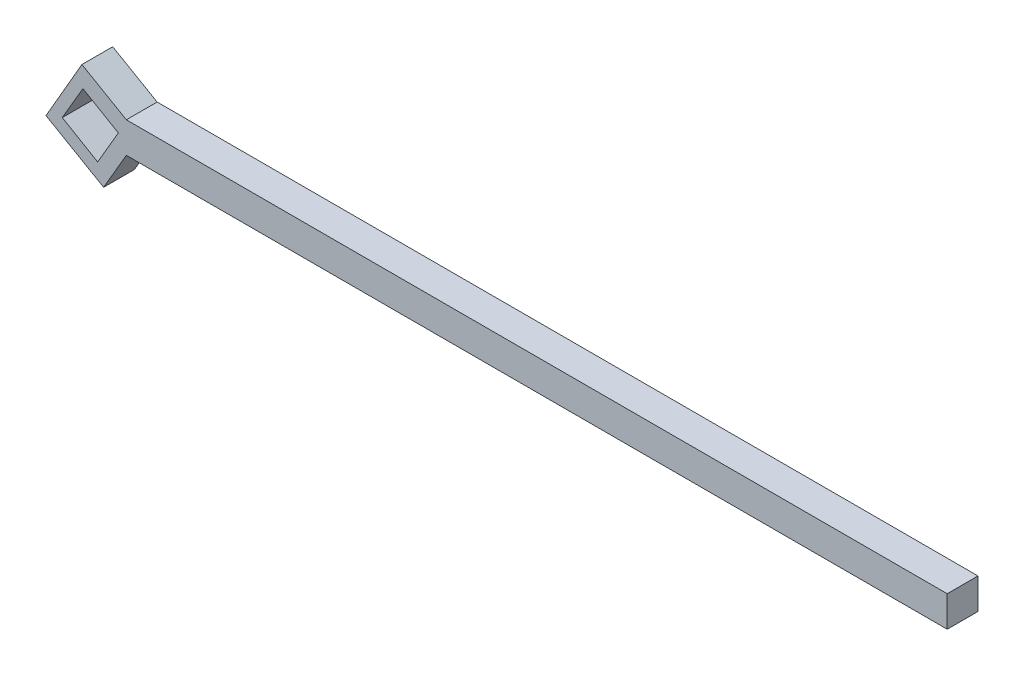
ISO-10303-21;
HEADER;
FILE_DESCRIPTION(('STEP AP214'),'2;1');
FILE_NAME('part.step','',(''),(''),'','','');
FILE_SCHEMA(('AUTOMOTIVE_DESIGN { 1 0 10303 214 1 1 1 1 }'));
ENDSEC;
DATA;
#1=APPLICATION_CONTEXT('core data for automotive mechanical design processes');
#2=APPLICATION_PROTOCOL_DEFINITION('international standard','automotive_design',2000,#1);
#3=PRODUCT_CONTEXT('',#1,'mechanical');
#4=PRODUCT('Part','Part','',(#3));
#5=PRODUCT_RELATED_PRODUCT_CATEGORY('part','',(#4));
#6=PRODUCT_DEFINITION_FORMATION('','',#4);
#7=PRODUCT_DEFINITION_CONTEXT('part definition',#1,'design');
#8=PRODUCT_DEFINITION('design','',#6,#7);
#9=PRODUCT_DEFINITION_SHAPE('','',#8);
#10=(LENGTH_UNIT() NAMED_UNIT(*) SI_UNIT(.MILLI.,.METRE.));
#11=(NAMED_UNIT(*) PLANE_ANGLE_UNIT() SI_UNIT($,.RADIAN.));
#12=(NAMED_UNIT(*) SI_UNIT($,.STERADIAN.) SOLID_ANGLE_UNIT());
#13=UNCERTAINTY_MEASURE_WITH_UNIT(LENGTH_MEASURE(1.E-05),#10,'distance_accuracy_value','');
#14=(GEOMETRIC_REPRESENTATION_CONTEXT(3) GLOBAL_UNCERTAINTY_ASSIGNED_CONTEXT((#13)) GLOBAL_UNIT_ASSIGNED_CONTEXT((#10,
#11,#12)) REPRESENTATION_CONTEXT('',''));
#15=CARTESIAN_POINT('',(0.,0.,0.));
#16=DIRECTION('',(0.,0.,1.));
#17=DIRECTION('',(1.,0.,0.));
#18=AXIS2_PLACEMENT_3D('',#15,#16,#17);
#19=CARTESIAN_POINT('',(0.,0.,15.));
#20=DIRECTION('',(0.,0.,1.));
#21=DIRECTION('',(1.,0.,0.));
#22=AXIS2_PLACEMENT_3D('',#19,#20,#21);
#23=PLANE('',#22);
#24=DIRECTION('',(0.502688216533599,0.864467788271067,0.));
#25=VECTOR('',#24,1.);
#26=CARTESIAN_POINT('',(-370.899758444666,-19.0266984378067,15.));
#27=LINE('',#26,#25);
#28=CARTESIAN_POINT('',(-370.899758444666,-19.0266984378067,15.));
#29=VERTEX_POINT('',#28);
#30=CARTESIAN_POINT('',(-359.835728952772,0.,15.));
#31=VERTEX_POINT('',#30);
#32=EDGE_CURVE('E153',#29,#31,#27,.T.);
#33=ORIENTED_EDGE('',*,*,#32,.T.);
#34=DIRECTION('',(1.,0.,0.));
#35=VECTOR('',#34,1.);
#36=CARTESIAN_POINT('',(40.1642710472279,0.,15.));
#37=LINE('',#36,#35);
#38=CARTESIAN_POINT('',(40.1642710472279,0.,15.));
#39=VERTEX_POINT('',#38);
#40=EDGE_CURVE('E156',#31,#39,#37,.T.);
#41=ORIENTED_EDGE('',*,*,#40,.T.);
#42=DIRECTION('',(0.,1.,0.));
#43=VECTOR('',#42,1.);
#44=CARTESIAN_POINT('',(40.1642710472279,15.,15.));
#45=LINE('',#44,#43);
#46=CARTESIAN_POINT('',(40.1642710472279,15.,15.));
#47=VERTEX_POINT('',#46);
#48=EDGE_CURVE('E159',#39,#47,#45,.T.);
#49=ORIENTED_EDGE('',*,*,#48,.T.);
#50=DIRECTION('',(-1.,0.,0.));
#51=VECTOR('',#50,1.);
#52=CARTESIAN_POINT('',(-359.835728952772,15.,15.));
#53=LINE('',#52,#51);
#54=CARTESIAN_POINT('',(-359.835728952772,15.,15.));
#55=VERTEX_POINT('',#54);
#56=EDGE_CURVE('E161',#47,#55,#53,.T.);
#57=ORIENTED_EDGE('',*,*,#56,.T.);
#58=DIRECTION('',(-0.866025403784438,0.5,0.));
#59=VECTOR('',#58,1.);
#60=CARTESIAN_POINT('',(-359.835728952772,15.,15.));
#61=LINE('',#60,#59);
#62=CARTESIAN_POINT('',(-381.486364047383,27.5,15.));
#63=VERTEX_POINT('',#62);
#64=EDGE_CURVE('E163',#55,#63,#61,.T.);
#65=ORIENTED_EDGE('',*,*,#64,.T.);
#66=DIRECTION('',(-0.499999999999999,-0.866025403784439,0.));
#67=VECTOR('',#66,1.);
#68=CARTESIAN_POINT('',(-381.486364047383,27.5,15.));
#69=LINE('',#68,#67);
#70=CARTESIAN_POINT('',(-398.986364047383,-2.81088913245537,15.));
#71=VERTEX_POINT('',#70);
#72=EDGE_CURVE('E165',#63,#71,#69,.T.);
#73=ORIENTED_EDGE('',*,*,#72,.T.);
#74=DIRECTION('',(0.866025403784438,-0.5,0.));
#75=VECTOR('',#74,1.);
#76=CARTESIAN_POINT('',(-398.986364047383,-2.81088913245537,15.));
#77=LINE('',#76,#75);
#78=EDGE_CURVE('E167',#71,#29,#77,.T.);
#79=ORIENTED_EDGE('',*,*,#78,.T.);
#80=EDGE_LOOP('',(#33,#41,#49,#57,#65,#73,#79));
#81=FACE_BOUND('',#80,.T.);
#82=DIRECTION('',(-0.863665805975953,0.504064852561561,0.));
#83=VECTOR('',#82,1.);
#84=CARTESIAN_POINT('',(-380.991936483583,17.5812970512311,15.));
#85=LINE('',#84,#83);
#86=CARTESIAN_POINT('',(-363.718620364064,7.5,15.));
#87=VERTEX_POINT('',#86);
#88=CARTESIAN_POINT('',(-380.991936483583,17.5812970512311,15.));
#89=VERTEX_POINT('',#88);
#90=EDGE_CURVE('E125',#87,#89,#85,.T.);
#91=ORIENTED_EDGE('',*,*,#90,.F.);
#92=DIRECTION('',(0.504064852561559,0.863665805975954,0.));
#93=VECTOR('',#92,1.);
#94=CARTESIAN_POINT('',(-363.718620364064,7.5,15.));
#95=LINE('',#94,#93);
#96=CARTESIAN_POINT('',(-373.799917415295,-9.77331611951907,15.));
#97=VERTEX_POINT('',#96);
#98=EDGE_CURVE('E117',#97,#87,#95,.T.);
#99=ORIENTED_EDGE('',*,*,#98,.F.);
#100=DIRECTION('',(0.863665805975953,-0.504064852561561,0.));
#101=VECTOR('',#100,1.);
#102=CARTESIAN_POINT('',(-373.799917415295,-9.77331611951907,15.));
#103=LINE('',#102,#101);
#104=CARTESIAN_POINT('',(-391.073233534814,0.307980931712137,15.));
#105=VERTEX_POINT('',#104);
#106=EDGE_CURVE('E139',#105,#97,#103,.T.);
#107=ORIENTED_EDGE('',*,*,#106,.F.);
#108=DIRECTION('',(-0.504064852561565,-0.86366580597595,0.));
#109=VECTOR('',#108,1.);
#110=CARTESIAN_POINT('',(-391.073233534814,0.307980931712144,15.));
#111=LINE('',#110,#109);
#112=EDGE_CURVE('E137',#89,#105,#111,.T.);
#113=ORIENTED_EDGE('',*,*,#112,.F.);
#114=EDGE_LOOP('',(#91,#99,#107,#113));
#115=FACE_BOUND('',#114,.T.);
#116=ADVANCED_FACE('F34',(#81,#115),#23,.T.);
#117=CARTESIAN_POINT('',(0.,0.,0.));
#118=DIRECTION('',(0.,0.,1.));
#119=DIRECTION('',(1.,0.,0.));
#120=AXIS2_PLACEMENT_3D('',#117,#118,#119);
#121=PLANE('',#120);
#122=DIRECTION('',(0.502688216533599,0.864467788271067,0.));
#123=VECTOR('',#122,1.);
#124=CARTESIAN_POINT('',(-370.899758444666,-19.0266984378067,0.));
#125=LINE('',#124,#123);
#126=CARTESIAN_POINT('',(-370.899758444666,-19.0266984378067,0.));
#127=VERTEX_POINT('',#126);
#128=CARTESIAN_POINT('',(-359.835728952772,0.,0.));
#129=VERTEX_POINT('',#128);
#130=EDGE_CURVE('E133',#127,#129,#125,.T.);
#131=ORIENTED_EDGE('',*,*,#130,.F.);
#132=DIRECTION('',(0.866025403784438,-0.5,0.));
#133=VECTOR('',#132,1.);
#134=CARTESIAN_POINT('',(-398.986364047383,-2.81088913245537,0.));
#135=LINE('',#134,#133);
#136=CARTESIAN_POINT('',(-398.986364047383,-2.81088913245537,0.));
#137=VERTEX_POINT('',#136);
#138=EDGE_CURVE('E157',#137,#127,#135,.T.);
#139=ORIENTED_EDGE('',*,*,#138,.F.);
#140=DIRECTION('',(-0.499999999999999,-0.866025403784439,0.));
#141=VECTOR('',#140,1.);
#142=CARTESIAN_POINT('',(-381.486364047383,27.5,0.));
#143=LINE('',#142,#141);
#144=CARTESIAN_POINT('',(-381.486364047383,27.5,0.));
#145=VERTEX_POINT('',#144);
#146=EDGE_CURVE('E180',#145,#137,#143,.T.);
#147=ORIENTED_EDGE('',*,*,#146,.F.);
#148=DIRECTION('',(-0.866025403784438,0.5,0.));
#149=VECTOR('',#148,1.);
#150=CARTESIAN_POINT('',(-359.835728952772,15.,0.));
#151=LINE('',#150,#149);
#152=CARTESIAN_POINT('',(-359.835728952772,15.,0.));
#153=VERTEX_POINT('',#152);
#154=EDGE_CURVE('E178',#153,#145,#151,.T.);
#155=ORIENTED_EDGE('',*,*,#154,.F.);
#156=DIRECTION('',(-1.,0.,0.));
#157=VECTOR('',#156,1.);
#158=CARTESIAN_POINT('',(-359.835728952772,15.,0.));
#159=LINE('',#158,#157);
#160=CARTESIAN_POINT('',(40.1642710472279,15.,0.));
#161=VERTEX_POINT('',#160);
#162=EDGE_CURVE('E176',#161,#153,#159,.T.);
#163=ORIENTED_EDGE('',*,*,#162,.F.);
#164=DIRECTION('',(0.,1.,0.));
#165=VECTOR('',#164,1.);
#166=CARTESIAN_POINT('',(40.1642710472279,15.,0.));
#167=LINE('',#166,#165);
#168=CARTESIAN_POINT('',(40.1642710472279,0.,0.));
#169=VERTEX_POINT('',#168);
#170=EDGE_CURVE('E174',#169,#161,#167,.T.);
#171=ORIENTED_EDGE('',*,*,#170,.F.);
#172=DIRECTION('',(1.,0.,0.));
#173=VECTOR('',#172,1.);
#174=CARTESIAN_POINT('',(40.1642710472279,0.,0.));
#175=LINE('',#174,#173);
#176=EDGE_CURVE('E172',#129,#169,#175,.T.);
#177=ORIENTED_EDGE('',*,*,#176,.F.);
#178=EDGE_LOOP('',(#131,#139,#147,#155,#163,#171,#177));
#179=FACE_BOUND('',#178,.T.);
#180=DIRECTION('',(0.504064852561559,0.863665805975954,0.));
#181=VECTOR('',#180,1.);
#182=CARTESIAN_POINT('',(-363.718620364064,7.5,0.));
#183=LINE('',#182,#181);
#184=CARTESIAN_POINT('',(-373.799917415295,-9.77331611951907,0.));
#185=VERTEX_POINT('',#184);
#186=CARTESIAN_POINT('',(-363.718620364064,7.5,0.));
#187=VERTEX_POINT('',#186);
#188=EDGE_CURVE('E57',#185,#187,#183,.T.);
#189=ORIENTED_EDGE('',*,*,#188,.T.);
#190=DIRECTION('',(-0.863665805975953,0.504064852561561,0.));
#191=VECTOR('',#190,1.);
#192=CARTESIAN_POINT('',(-380.991936483583,17.5812970512311,0.));
#193=LINE('',#192,#191);
#194=CARTESIAN_POINT('',(-380.991936483583,17.5812970512311,0.));
#195=VERTEX_POINT('',#194);
#196=EDGE_CURVE('E132',#187,#195,#193,.T.);
#197=ORIENTED_EDGE('',*,*,#196,.T.);
#198=DIRECTION('',(-0.504064852561565,-0.86366580597595,0.));
#199=VECTOR('',#198,1.);
#200=CARTESIAN_POINT('',(-391.073233534814,0.307980931712144,0.));
#201=LINE('',#200,#199);
#202=CARTESIAN_POINT('',(-391.073233534814,0.307980931712144,0.));
#203=VERTEX_POINT('',#202);
#204=EDGE_CURVE('E145',#195,#203,#201,.T.);
#205=ORIENTED_EDGE('',*,*,#204,.T.);
#206=DIRECTION('',(0.863665805975953,-0.504064852561561,0.));
#207=VECTOR('',#206,1.);
#208=CARTESIAN_POINT('',(-373.799917415295,-9.77331611951907,0.));
#209=LINE('',#208,#207);
#210=EDGE_CURVE('E126',#203,#185,#209,.T.);
#211=ORIENTED_EDGE('',*,*,#210,.T.);
#212=EDGE_LOOP('',(#189,#197,#205,#211));
#213=FACE_BOUND('',#212,.T.);
#214=ADVANCED_FACE('F207',(#179,#213),#121,.F.);
#215=CARTESIAN_POINT('',(-370.899758444666,-19.0266984378067,15.));
#216=DIRECTION('',(-0.864467788271067,0.502688216533599,0.));
#217=DIRECTION('',(-0.502688216533599,-0.864467788271067,0.));
#218=AXIS2_PLACEMENT_3D('',#215,#216,#217);
#219=PLANE('',#218);
#220=ORIENTED_EDGE('',*,*,#130,.T.);
#221=DIRECTION('',(0.,0.,-1.));
#222=VECTOR('',#221,1.);
#223=CARTESIAN_POINT('',(-359.835728952772,0.,15.));
#224=LINE('',#223,#222);
#225=EDGE_CURVE('E11',#31,#129,#224,.T.);
#226=ORIENTED_EDGE('',*,*,#225,.F.);
#227=ORIENTED_EDGE('',*,*,#32,.F.);
#228=DIRECTION('',(0.,0.,-1.));
#229=VECTOR('',#228,1.);
#230=CARTESIAN_POINT('',(-370.899758444666,-19.0266984378067,15.));
#231=LINE('',#230,#229);
#232=EDGE_CURVE('E169',#29,#127,#231,.T.);
#233=ORIENTED_EDGE('',*,*,#232,.T.);
#234=EDGE_LOOP('',(#220,#226,#227,#233));
#235=FACE_BOUND('',#234,.T.);
#236=ADVANCED_FACE('F36',(#235),#219,.F.);
#237=CARTESIAN_POINT('',(40.1642710472279,0.,15.));
#238=DIRECTION('',(0.,1.,0.));
#239=DIRECTION('',(-1.,0.,0.));
#240=AXIS2_PLACEMENT_3D('',#237,#238,#239);
#241=PLANE('',#240);
#242=ORIENTED_EDGE('',*,*,#176,.T.);
#243=DIRECTION('',(0.,0.,-1.));
#244=VECTOR('',#243,1.);
#245=CARTESIAN_POINT('',(40.1642710472279,0.,15.));
#246=LINE('',#245,#244);
#247=EDGE_CURVE('E42',#39,#169,#246,.T.);
#248=ORIENTED_EDGE('',*,*,#247,.F.);
#249=ORIENTED_EDGE('',*,*,#40,.F.);
#250=ORIENTED_EDGE('',*,*,#225,.T.);
#251=EDGE_LOOP('',(#242,#248,#249,#250));
#252=FACE_BOUND('',#251,.T.);
#253=ADVANCED_FACE('F224',(#252),#241,.F.);
#254=CARTESIAN_POINT('',(40.1642710472279,15.,15.));
#255=DIRECTION('',(-1.,0.,0.));
#256=DIRECTION('',(0.,-1.,0.));
#257=AXIS2_PLACEMENT_3D('',#254,#255,#256);
#258=PLANE('',#257);
#259=ORIENTED_EDGE('',*,*,#170,.T.);
#260=DIRECTION('',(0.,0.,-1.));
#261=VECTOR('',#260,1.);
#262=CARTESIAN_POINT('',(40.1642710472279,15.,15.));
#263=LINE('',#262,#261);
#264=EDGE_CURVE('E194',#47,#161,#263,.T.);
#265=ORIENTED_EDGE('',*,*,#264,.F.);
#266=ORIENTED_EDGE('',*,*,#48,.F.);
#267=ORIENTED_EDGE('',*,*,#247,.T.);
#268=EDGE_LOOP('',(#259,#265,#266,#267));
#269=FACE_BOUND('',#268,.T.);
#270=ADVANCED_FACE('F201',(#269),#258,.F.);
#271=CARTESIAN_POINT('',(-359.835728952772,15.,15.));
#272=DIRECTION('',(0.,-1.,0.));
#273=DIRECTION('',(0.,0.,-1.));
#274=AXIS2_PLACEMENT_3D('',#271,#272,#273);
#275=PLANE('',#274);
#276=ORIENTED_EDGE('',*,*,#162,.T.);
#277=DIRECTION('',(0.,0.,-1.));
#278=VECTOR('',#277,1.);
#279=CARTESIAN_POINT('',(-359.835728952772,15.,15.));
#280=LINE('',#279,#278);
#281=EDGE_CURVE('E191',#55,#153,#280,.T.);
#282=ORIENTED_EDGE('',*,*,#281,.F.);
#283=ORIENTED_EDGE('',*,*,#56,.F.);
#284=ORIENTED_EDGE('',*,*,#264,.T.);
#285=EDGE_LOOP('',(#276,#282,#283,#284));
#286=FACE_BOUND('',#285,.T.);
#287=ADVANCED_FACE('F213',(#286),#275,.F.);
#288=CARTESIAN_POINT('',(-359.835728952772,15.,15.));
#289=DIRECTION('',(-0.5,-0.866025403784438,0.));
#290=DIRECTION('',(0.866025403784439,-0.5,0.));
#291=AXIS2_PLACEMENT_3D('',#288,#289,#290);
#292=PLANE('',#291);
#293=ORIENTED_EDGE('',*,*,#154,.T.);
#294=DIRECTION('',(0.,0.,-1.));
#295=VECTOR('',#294,1.);
#296=CARTESIAN_POINT('',(-381.486364047383,27.5,15.));
#297=LINE('',#296,#295);
#298=EDGE_CURVE('E188',#63,#145,#297,.T.);
#299=ORIENTED_EDGE('',*,*,#298,.F.);
#300=ORIENTED_EDGE('',*,*,#64,.F.);
#301=ORIENTED_EDGE('',*,*,#281,.T.);
#302=EDGE_LOOP('',(#293,#299,#300,#301));
#303=FACE_BOUND('',#302,.T.);
#304=ADVANCED_FACE('F217',(#303),#292,.F.);
#305=CARTESIAN_POINT('',(-381.486364047383,27.5,15.));
#306=DIRECTION('',(0.866025403784439,-0.499999999999999,0.));
#307=DIRECTION('',(0.499999999999999,0.866025403784439,0.));
#308=AXIS2_PLACEMENT_3D('',#305,#306,#307);
#309=PLANE('',#308);
#310=ORIENTED_EDGE('',*,*,#146,.T.);
#311=DIRECTION('',(0.,0.,-1.));
#312=VECTOR('',#311,1.);
#313=CARTESIAN_POINT('',(-398.986364047383,-2.81088913245537,15.));
#314=LINE('',#313,#312);
#315=EDGE_CURVE('E185',#71,#137,#314,.T.);
#316=ORIENTED_EDGE('',*,*,#315,.F.);
#317=ORIENTED_EDGE('',*,*,#72,.F.);
#318=ORIENTED_EDGE('',*,*,#298,.T.);
#319=EDGE_LOOP('',(#310,#316,#317,#318));
#320=FACE_BOUND('',#319,.T.);
#321=ADVANCED_FACE('F232',(#320),#309,.F.);
#322=CARTESIAN_POINT('',(-398.986364047383,-2.81088913245537,15.));
#323=DIRECTION('',(0.5,0.866025403784438,0.));
#324=DIRECTION('',(-0.866025403784438,0.500000000000001,0.));
#325=AXIS2_PLACEMENT_3D('',#322,#323,#324);
#326=PLANE('',#325);
#327=ORIENTED_EDGE('',*,*,#138,.T.);
#328=ORIENTED_EDGE('',*,*,#232,.F.);
#329=ORIENTED_EDGE('',*,*,#78,.F.);
#330=ORIENTED_EDGE('',*,*,#315,.T.);
#331=EDGE_LOOP('',(#327,#328,#329,#330));
#332=FACE_BOUND('',#331,.T.);
#333=ADVANCED_FACE('F229',(#332),#326,.F.);
#334=CARTESIAN_POINT('',(-363.718620364064,7.5,15.));
#335=DIRECTION('',(-0.863665805975954,0.504064852561559,0.));
#336=DIRECTION('',(-0.504064852561559,-0.863665805975954,0.));
#337=AXIS2_PLACEMENT_3D('',#334,#335,#336);
#338=PLANE('',#337);
#339=ORIENTED_EDGE('',*,*,#188,.F.);
#340=DIRECTION('',(0.,0.,-1.));
#341=VECTOR('',#340,1.);
#342=CARTESIAN_POINT('',(-373.799917415295,-9.77331611951907,15.));
#343=LINE('',#342,#341);
#344=EDGE_CURVE('E121',#97,#185,#343,.T.);
#345=ORIENTED_EDGE('',*,*,#344,.F.);
#346=ORIENTED_EDGE('',*,*,#98,.T.);
#347=DIRECTION('',(0.,0.,-1.));
#348=VECTOR('',#347,1.);
#349=CARTESIAN_POINT('',(-363.718620364064,7.5,15.));
#350=LINE('',#349,#348);
#351=EDGE_CURVE('E120',#87,#187,#350,.T.);
#352=ORIENTED_EDGE('',*,*,#351,.T.);
#353=EDGE_LOOP('',(#339,#345,#346,#352));
#354=FACE_BOUND('',#353,.T.);
#355=ADVANCED_FACE('F119',(#354),#338,.T.);
#356=CARTESIAN_POINT('',(-380.991936483583,17.5812970512311,15.));
#357=DIRECTION('',(-0.504064852561561,-0.863665805975953,0.));
#358=DIRECTION('',(0.863665805975953,-0.504064852561561,0.));
#359=AXIS2_PLACEMENT_3D('',#356,#357,#358);
#360=PLANE('',#359);
#361=ORIENTED_EDGE('',*,*,#196,.F.);
#362=ORIENTED_EDGE('',*,*,#351,.F.);
#363=ORIENTED_EDGE('',*,*,#90,.T.);
#364=DIRECTION('',(0.,0.,-1.));
#365=VECTOR('',#364,1.);
#366=CARTESIAN_POINT('',(-380.991936483583,17.5812970512311,15.));
#367=LINE('',#366,#365);
#368=EDGE_CURVE('E134',#89,#195,#367,.T.);
#369=ORIENTED_EDGE('',*,*,#368,.T.);
#370=EDGE_LOOP('',(#361,#362,#363,#369));
#371=FACE_BOUND('',#370,.T.);
#372=ADVANCED_FACE('F129',(#371),#360,.T.);
#373=CARTESIAN_POINT('',(-391.073233534814,0.307980931712144,15.));
#374=DIRECTION('',(0.86366580597595,-0.504064852561565,0.));
#375=DIRECTION('',(0.504064852561565,0.863665805975951,0.));
#376=AXIS2_PLACEMENT_3D('',#373,#374,#375);
#377=PLANE('',#376);
#378=ORIENTED_EDGE('',*,*,#204,.F.);
#379=ORIENTED_EDGE('',*,*,#368,.F.);
#380=ORIENTED_EDGE('',*,*,#112,.T.);
#381=DIRECTION('',(0.,0.,-1.));
#382=VECTOR('',#381,1.);
#383=CARTESIAN_POINT('',(-391.073233534814,0.307980931712144,15.));
#384=LINE('',#383,#382);
#385=EDGE_CURVE('E49',#105,#203,#384,.T.);
#386=ORIENTED_EDGE('',*,*,#385,.T.);
#387=EDGE_LOOP('',(#378,#379,#380,#386));
#388=FACE_BOUND('',#387,.T.);
#389=ADVANCED_FACE('F252',(#388),#377,.T.);
#390=CARTESIAN_POINT('',(-373.799917415295,-9.77331611951907,15.));
#391=DIRECTION('',(0.504064852561561,0.863665805975953,0.));
#392=DIRECTION('',(-0.863665805975953,0.504064852561561,0.));
#393=AXIS2_PLACEMENT_3D('',#390,#391,#392);
#394=PLANE('',#393);
#395=ORIENTED_EDGE('',*,*,#210,.F.);
#396=ORIENTED_EDGE('',*,*,#385,.F.);
#397=ORIENTED_EDGE('',*,*,#106,.T.);
#398=ORIENTED_EDGE('',*,*,#344,.T.);
#399=EDGE_LOOP('',(#395,#396,#397,#398));
#400=FACE_BOUND('',#399,.T.);
#401=ADVANCED_FACE('F255',(#400),#394,.T.);
#402=CLOSED_SHELL('',(#116,#214,#236,#253,#270,#287,#304,#321,#333,#355,#372,#389,#401));
#403=MANIFOLD_SOLID_BREP('B2',#402);
#404=ADVANCED_BREP_SHAPE_REPRESENTATION('',(#18,#403),#14);
#405=SHAPE_DEFINITION_REPRESENTATION(#9,#404);
ENDSEC;
END-ISO-10303-21;
